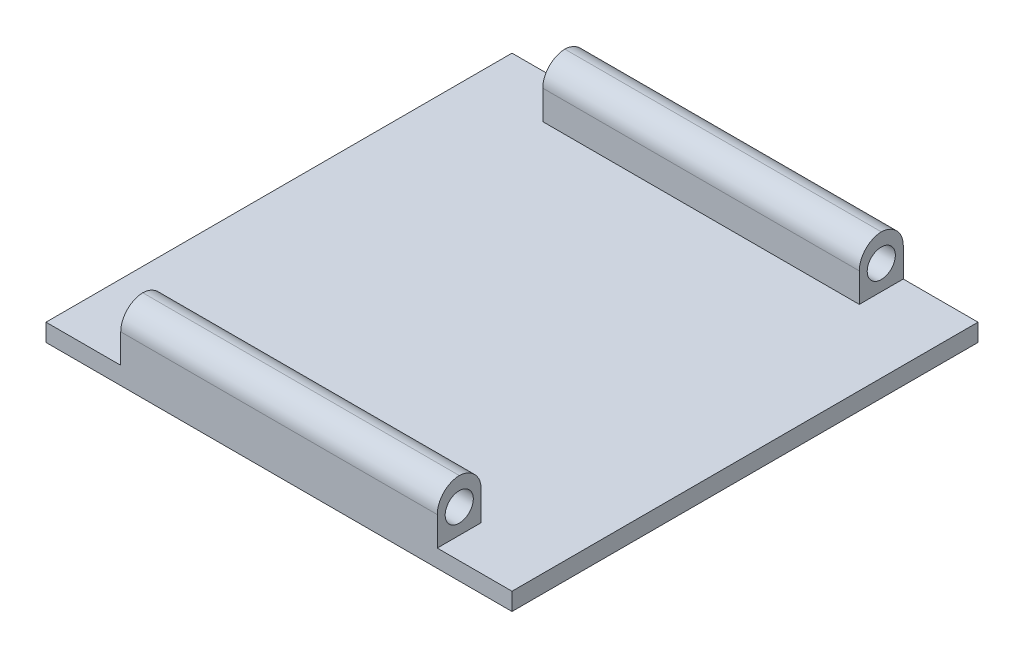
ISO-10303-21;
HEADER;
FILE_DESCRIPTION(('STEP AP214'),'2;1');
FILE_NAME('part.step','',(''),(''),'','','');
FILE_SCHEMA(('AUTOMOTIVE_DESIGN { 1 0 10303 214 1 1 1 1 }'));
ENDSEC;
DATA;
#1=APPLICATION_CONTEXT('core data for automotive mechanical design processes');
#2=APPLICATION_PROTOCOL_DEFINITION('international standard','automotive_design',2000,#1);
#3=PRODUCT_CONTEXT('',#1,'mechanical');
#4=PRODUCT('Part','Part','',(#3));
#5=PRODUCT_RELATED_PRODUCT_CATEGORY('part','',(#4));
#6=PRODUCT_DEFINITION_FORMATION('','',#4);
#7=PRODUCT_DEFINITION_CONTEXT('part definition',#1,'design');
#8=PRODUCT_DEFINITION('design','',#6,#7);
#9=PRODUCT_DEFINITION_SHAPE('','',#8);
#10=(LENGTH_UNIT() NAMED_UNIT(*) SI_UNIT(.MILLI.,.METRE.));
#11=(NAMED_UNIT(*) PLANE_ANGLE_UNIT() SI_UNIT($,.RADIAN.));
#12=(NAMED_UNIT(*) SI_UNIT($,.STERADIAN.) SOLID_ANGLE_UNIT());
#13=UNCERTAINTY_MEASURE_WITH_UNIT(LENGTH_MEASURE(1.E-05),#10,'distance_accuracy_value','');
#14=(GEOMETRIC_REPRESENTATION_CONTEXT(3) GLOBAL_UNCERTAINTY_ASSIGNED_CONTEXT((#13)) GLOBAL_UNIT_ASSIGNED_CONTEXT((#10,
#11,#12)) REPRESENTATION_CONTEXT('',''));
#15=CARTESIAN_POINT('',(0.,0.,0.));
#16=DIRECTION('',(0.,0.,1.));
#17=DIRECTION('',(1.,0.,0.));
#18=AXIS2_PLACEMENT_3D('',#15,#16,#17);
#19=CARTESIAN_POINT('',(0.,2.,0.));
#20=DIRECTION('',(0.,-1.,0.));
#21=DIRECTION('',(0.,0.,-1.));
#22=AXIS2_PLACEMENT_3D('',#19,#20,#21);
#23=PLANE('',#22);
#24=DIRECTION('',(0.,0.,1.));
#25=VECTOR('',#24,1.);
#26=CARTESIAN_POINT('',(-18.,2.,26.5));
#27=LINE('',#26,#25);
#28=CARTESIAN_POINT('',(-18.,2.,21.5));
#29=VERTEX_POINT('',#28);
#30=CARTESIAN_POINT('',(-18.,2.,26.5));
#31=VERTEX_POINT('',#30);
#32=EDGE_CURVE('E165',#29,#31,#27,.T.);
#33=ORIENTED_EDGE('',*,*,#32,.F.);
#34=DIRECTION('',(-1.,0.,0.));
#35=VECTOR('',#34,1.);
#36=CARTESIAN_POINT('',(-18.,2.,21.5));
#37=LINE('',#36,#35);
#38=CARTESIAN_POINT('',(18.,2.,21.5));
#39=VERTEX_POINT('',#38);
#40=EDGE_CURVE('E163',#39,#29,#37,.T.);
#41=ORIENTED_EDGE('',*,*,#40,.F.);
#42=DIRECTION('',(0.,0.,-1.));
#43=VECTOR('',#42,1.);
#44=CARTESIAN_POINT('',(18.,2.,21.5));
#45=LINE('',#44,#43);
#46=CARTESIAN_POINT('',(18.,2.,26.5));
#47=VERTEX_POINT('',#46);
#48=EDGE_CURVE('E141',#47,#39,#45,.T.);
#49=ORIENTED_EDGE('',*,*,#48,.F.);
#50=DIRECTION('',(1.,0.,0.));
#51=VECTOR('',#50,1.);
#52=CARTESIAN_POINT('',(-26.5,2.,26.5));
#53=LINE('',#52,#51);
#54=CARTESIAN_POINT('',(26.5,2.,26.5));
#55=VERTEX_POINT('',#54);
#56=EDGE_CURVE('E149',#47,#55,#53,.T.);
#57=ORIENTED_EDGE('',*,*,#56,.T.);
#58=DIRECTION('',(0.,0.,-1.));
#59=VECTOR('',#58,1.);
#60=CARTESIAN_POINT('',(26.5,2.,26.5));
#61=LINE('',#60,#59);
#62=CARTESIAN_POINT('',(26.5,2.,-26.5));
#63=VERTEX_POINT('',#62);
#64=EDGE_CURVE('E207',#55,#63,#61,.T.);
#65=ORIENTED_EDGE('',*,*,#64,.T.);
#66=DIRECTION('',(-1.,0.,0.));
#67=VECTOR('',#66,1.);
#68=CARTESIAN_POINT('',(-26.5,2.,-26.5));
#69=LINE('',#68,#67);
#70=CARTESIAN_POINT('',(18.,2.,-26.5));
#71=VERTEX_POINT('',#70);
#72=EDGE_CURVE('E212',#63,#71,#69,.T.);
#73=ORIENTED_EDGE('',*,*,#72,.T.);
#74=DIRECTION('',(0.,0.,-1.));
#75=VECTOR('',#74,1.);
#76=CARTESIAN_POINT('',(18.,2.,-21.5));
#77=LINE('',#76,#75);
#78=CARTESIAN_POINT('',(18.,2.,-21.5));
#79=VERTEX_POINT('',#78);
#80=EDGE_CURVE('E190',#79,#71,#77,.T.);
#81=ORIENTED_EDGE('',*,*,#80,.F.);
#82=DIRECTION('',(1.,0.,0.));
#83=VECTOR('',#82,1.);
#84=CARTESIAN_POINT('',(-18.,2.,-21.5));
#85=LINE('',#84,#83);
#86=CARTESIAN_POINT('',(-18.,2.,-21.5));
#87=VERTEX_POINT('',#86);
#88=EDGE_CURVE('E186',#87,#79,#85,.T.);
#89=ORIENTED_EDGE('',*,*,#88,.F.);
#90=DIRECTION('',(0.,0.,1.));
#91=VECTOR('',#90,1.);
#92=CARTESIAN_POINT('',(-18.,2.,-26.5));
#93=LINE('',#92,#91);
#94=CARTESIAN_POINT('',(-18.,2.,-26.5));
#95=VERTEX_POINT('',#94);
#96=EDGE_CURVE('E182',#95,#87,#93,.T.);
#97=ORIENTED_EDGE('',*,*,#96,.F.);
#98=CARTESIAN_POINT('',(-26.5,2.,-26.5));
#99=VERTEX_POINT('',#98);
#100=EDGE_CURVE('E210',#95,#99,#69,.T.);
#101=ORIENTED_EDGE('',*,*,#100,.T.);
#102=DIRECTION('',(0.,0.,1.));
#103=VECTOR('',#102,1.);
#104=CARTESIAN_POINT('',(-26.5,2.,26.5));
#105=LINE('',#104,#103);
#106=CARTESIAN_POINT('',(-26.5,2.,26.5));
#107=VERTEX_POINT('',#106);
#108=EDGE_CURVE('E158',#99,#107,#105,.T.);
#109=ORIENTED_EDGE('',*,*,#108,.T.);
#110=EDGE_CURVE('E157',#107,#31,#53,.T.);
#111=ORIENTED_EDGE('',*,*,#110,.T.);
#112=EDGE_LOOP('',(#33,#41,#49,#57,#65,#73,#81,#89,#97,#101,#109,#111));
#113=FACE_BOUND('',#112,.T.);
#114=ADVANCED_FACE('F39',(#113),#23,.F.);
#115=CARTESIAN_POINT('',(26.5,2.,26.5));
#116=DIRECTION('',(-1.,0.,0.));
#117=DIRECTION('',(0.,0.,1.));
#118=AXIS2_PLACEMENT_3D('',#115,#116,#117);
#119=PLANE('',#118);
#120=DIRECTION('',(0.,0.,-1.));
#121=VECTOR('',#120,1.);
#122=CARTESIAN_POINT('',(26.5,0.,26.5));
#123=LINE('',#122,#121);
#124=CARTESIAN_POINT('',(26.5,0.,26.5));
#125=VERTEX_POINT('',#124);
#126=CARTESIAN_POINT('',(26.5,0.,-26.5));
#127=VERTEX_POINT('',#126);
#128=EDGE_CURVE('E206',#125,#127,#123,.T.);
#129=ORIENTED_EDGE('',*,*,#128,.T.);
#130=DIRECTION('',(0.,-1.,0.));
#131=VECTOR('',#130,1.);
#132=CARTESIAN_POINT('',(26.5,2.,-26.5));
#133=LINE('',#132,#131);
#134=EDGE_CURVE('E241',#63,#127,#133,.T.);
#135=ORIENTED_EDGE('',*,*,#134,.F.);
#136=ORIENTED_EDGE('',*,*,#64,.F.);
#137=DIRECTION('',(0.,-1.,0.));
#138=VECTOR('',#137,1.);
#139=CARTESIAN_POINT('',(26.5,2.,26.5));
#140=LINE('',#139,#138);
#141=EDGE_CURVE('E152',#55,#125,#140,.T.);
#142=ORIENTED_EDGE('',*,*,#141,.T.);
#143=EDGE_LOOP('',(#129,#135,#136,#142));
#144=FACE_BOUND('',#143,.T.);
#145=ADVANCED_FACE('F318',(#144),#119,.F.);
#146=CARTESIAN_POINT('',(-26.5,2.,-26.5));
#147=DIRECTION('',(0.,0.,1.));
#148=DIRECTION('',(1.,0.,0.));
#149=AXIS2_PLACEMENT_3D('',#146,#147,#148);
#150=PLANE('',#149);
#151=DIRECTION('',(0.,-1.,0.));
#152=VECTOR('',#151,1.);
#153=CARTESIAN_POINT('',(-18.,7.9,-26.5));
#154=LINE('',#153,#152);
#155=CARTESIAN_POINT('',(-18.,5.3,-26.5));
#156=VERTEX_POINT('',#155);
#157=EDGE_CURVE('E194',#156,#95,#154,.T.);
#158=ORIENTED_EDGE('',*,*,#157,.F.);
#159=DIRECTION('',(-1.,0.,0.));
#160=VECTOR('',#159,1.);
#161=CARTESIAN_POINT('',(18.,5.3,-26.5));
#162=LINE('',#161,#160);
#163=CARTESIAN_POINT('',(18.,5.3,-26.5));
#164=VERTEX_POINT('',#163);
#165=EDGE_CURVE('E251',#156,#164,#162,.F.);
#166=ORIENTED_EDGE('',*,*,#165,.T.);
#167=DIRECTION('',(0.,-1.,0.));
#168=VECTOR('',#167,1.);
#169=CARTESIAN_POINT('',(18.,7.9,-26.5));
#170=LINE('',#169,#168);
#171=EDGE_CURVE('E197',#164,#71,#170,.T.);
#172=ORIENTED_EDGE('',*,*,#171,.T.);
#173=ORIENTED_EDGE('',*,*,#72,.F.);
#174=ORIENTED_EDGE('',*,*,#134,.T.);
#175=DIRECTION('',(-1.,0.,0.));
#176=VECTOR('',#175,1.);
#177=CARTESIAN_POINT('',(-26.5,0.,-26.5));
#178=LINE('',#177,#176);
#179=CARTESIAN_POINT('',(-26.5,0.,-26.5));
#180=VERTEX_POINT('',#179);
#181=EDGE_CURVE('E223',#127,#180,#178,.T.);
#182=ORIENTED_EDGE('',*,*,#181,.T.);
#183=DIRECTION('',(0.,-1.,0.));
#184=VECTOR('',#183,1.);
#185=CARTESIAN_POINT('',(-26.5,2.,-26.5));
#186=LINE('',#185,#184);
#187=EDGE_CURVE('E237',#99,#180,#186,.T.);
#188=ORIENTED_EDGE('',*,*,#187,.F.);
#189=ORIENTED_EDGE('',*,*,#100,.F.);
#190=EDGE_LOOP('',(#158,#166,#172,#173,#174,#182,#188,#189));
#191=FACE_BOUND('',#190,.T.);
#192=ADVANCED_FACE('F323',(#191),#150,.F.);
#193=CARTESIAN_POINT('',(-26.5,2.,26.5));
#194=DIRECTION('',(1.,0.,0.));
#195=DIRECTION('',(0.,0.,-1.));
#196=AXIS2_PLACEMENT_3D('',#193,#194,#195);
#197=PLANE('',#196);
#198=DIRECTION('',(0.,0.,1.));
#199=VECTOR('',#198,1.);
#200=CARTESIAN_POINT('',(-26.5,0.,26.5));
#201=LINE('',#200,#199);
#202=CARTESIAN_POINT('',(-26.5,0.,26.5));
#203=VERTEX_POINT('',#202);
#204=EDGE_CURVE('E226',#180,#203,#201,.T.);
#205=ORIENTED_EDGE('',*,*,#204,.T.);
#206=DIRECTION('',(0.,-1.,0.));
#207=VECTOR('',#206,1.);
#208=CARTESIAN_POINT('',(-26.5,2.,26.5));
#209=LINE('',#208,#207);
#210=EDGE_CURVE('E233',#107,#203,#209,.T.);
#211=ORIENTED_EDGE('',*,*,#210,.F.);
#212=ORIENTED_EDGE('',*,*,#108,.F.);
#213=ORIENTED_EDGE('',*,*,#187,.T.);
#214=EDGE_LOOP('',(#205,#211,#212,#213));
#215=FACE_BOUND('',#214,.T.);
#216=ADVANCED_FACE('F336',(#215),#197,.F.);
#217=CARTESIAN_POINT('',(-26.5,2.,26.5));
#218=DIRECTION('',(0.,0.,-1.));
#219=DIRECTION('',(-1.,0.,0.));
#220=AXIS2_PLACEMENT_3D('',#217,#218,#219);
#221=PLANE('',#220);
#222=DIRECTION('',(0.,-1.,0.));
#223=VECTOR('',#222,1.);
#224=CARTESIAN_POINT('',(18.,7.9,26.5));
#225=LINE('',#224,#223);
#226=CARTESIAN_POINT('',(18.,5.3,26.5));
#227=VERTEX_POINT('',#226);
#228=EDGE_CURVE('E137',#227,#47,#225,.T.);
#229=ORIENTED_EDGE('',*,*,#228,.F.);
#230=DIRECTION('',(1.,0.,0.));
#231=VECTOR('',#230,1.);
#232=CARTESIAN_POINT('',(-26.5,5.3,26.5));
#233=LINE('',#232,#231);
#234=CARTESIAN_POINT('',(-18.,5.3,26.5));
#235=VERTEX_POINT('',#234);
#236=EDGE_CURVE('E11',#227,#235,#233,.F.);
#237=ORIENTED_EDGE('',*,*,#236,.T.);
#238=DIRECTION('',(0.,-1.,0.));
#239=VECTOR('',#238,1.);
#240=CARTESIAN_POINT('',(-18.,7.9,26.5));
#241=LINE('',#240,#239);
#242=EDGE_CURVE('E145',#235,#31,#241,.T.);
#243=ORIENTED_EDGE('',*,*,#242,.T.);
#244=ORIENTED_EDGE('',*,*,#110,.F.);
#245=ORIENTED_EDGE('',*,*,#210,.T.);
#246=DIRECTION('',(1.,0.,0.));
#247=VECTOR('',#246,1.);
#248=CARTESIAN_POINT('',(-26.5,0.,26.5));
#249=LINE('',#248,#247);
#250=EDGE_CURVE('E211',#203,#125,#249,.T.);
#251=ORIENTED_EDGE('',*,*,#250,.T.);
#252=ORIENTED_EDGE('',*,*,#141,.F.);
#253=ORIENTED_EDGE('',*,*,#56,.F.);
#254=EDGE_LOOP('',(#229,#237,#243,#244,#245,#251,#252,#253));
#255=FACE_BOUND('',#254,.T.);
#256=ADVANCED_FACE('F150',(#255),#221,.F.);
#257=CARTESIAN_POINT('',(0.,0.,0.));
#258=DIRECTION('',(0.,-1.,0.));
#259=DIRECTION('',(0.,0.,-1.));
#260=AXIS2_PLACEMENT_3D('',#257,#258,#259);
#261=PLANE('',#260);
#262=ORIENTED_EDGE('',*,*,#128,.F.);
#263=ORIENTED_EDGE('',*,*,#250,.F.);
#264=ORIENTED_EDGE('',*,*,#204,.F.);
#265=ORIENTED_EDGE('',*,*,#181,.F.);
#266=EDGE_LOOP('',(#262,#263,#264,#265));
#267=FACE_BOUND('',#266,.T.);
#268=ADVANCED_FACE('F330',(#267),#261,.T.);
#269=CARTESIAN_POINT('',(-18.,7.9,-26.5));
#270=DIRECTION('',(1.,0.,0.));
#271=DIRECTION('',(0.,0.,-1.));
#272=AXIS2_PLACEMENT_3D('',#269,#270,#271);
#273=PLANE('',#272);
#274=CARTESIAN_POINT('',(-18.,4.8,-24.));
#275=DIRECTION('',(1.,0.,0.));
#276=DIRECTION('',(0.,0.,1.));
#277=AXIS2_PLACEMENT_3D('',#274,#275,#276);
#278=CIRCLE('',#277,1.60000000000001);
#279=CARTESIAN_POINT('',(-18.,4.8,-22.4));
#280=VERTEX_POINT('',#279);
#281=EDGE_CURVE('E280',#280,#280,#278,.T.);
#282=ORIENTED_EDGE('',*,*,#281,.T.);
#283=EDGE_LOOP('',(#282));
#284=FACE_BOUND('',#283,.T.);
#285=CARTESIAN_POINT('',(-18.,5.3,-24.1));
#286=DIRECTION('',(1.,0.,0.));
#287=DIRECTION('',(0.,0.,-1.));
#288=AXIS2_PLACEMENT_3D('',#285,#286,#287);
#289=CIRCLE('',#288,2.6);
#290=CARTESIAN_POINT('',(-18.,5.3,-21.5));
#291=VERTEX_POINT('',#290);
#292=CARTESIAN_POINT('',(-18.,7.89807621135332,-24.));
#293=VERTEX_POINT('',#292);
#294=EDGE_CURVE('E245',#291,#293,#289,.F.);
#295=ORIENTED_EDGE('',*,*,#294,.T.);
#296=CARTESIAN_POINT('',(-18.,5.3,-23.9));
#297=DIRECTION('',(1.,0.,0.));
#298=DIRECTION('',(0.,0.,-1.));
#299=AXIS2_PLACEMENT_3D('',#296,#297,#298);
#300=CIRCLE('',#299,2.6);
#301=EDGE_CURVE('E248',#293,#156,#300,.F.);
#302=ORIENTED_EDGE('',*,*,#301,.T.);
#303=ORIENTED_EDGE('',*,*,#157,.T.);
#304=ORIENTED_EDGE('',*,*,#96,.T.);
#305=DIRECTION('',(0.,-1.,0.));
#306=VECTOR('',#305,1.);
#307=CARTESIAN_POINT('',(-18.,7.9,-21.5));
#308=LINE('',#307,#306);
#309=EDGE_CURVE('E203',#291,#87,#308,.T.);
#310=ORIENTED_EDGE('',*,*,#309,.F.);
#311=EDGE_LOOP('',(#295,#302,#303,#304,#310));
#312=FACE_BOUND('',#311,.T.);
#313=ADVANCED_FACE('F328',(#284,#312),#273,.F.);
#314=CARTESIAN_POINT('',(-18.,7.9,-21.5));
#315=DIRECTION('',(0.,0.,-1.));
#316=DIRECTION('',(-1.,0.,0.));
#317=AXIS2_PLACEMENT_3D('',#314,#315,#316);
#318=PLANE('',#317);
#319=DIRECTION('',(0.,-1.,0.));
#320=VECTOR('',#319,1.);
#321=CARTESIAN_POINT('',(18.,7.9,-21.5));
#322=LINE('',#321,#320);
#323=CARTESIAN_POINT('',(18.,5.3,-21.5));
#324=VERTEX_POINT('',#323);
#325=EDGE_CURVE('E200',#324,#79,#322,.T.);
#326=ORIENTED_EDGE('',*,*,#325,.F.);
#327=DIRECTION('',(1.,0.,0.));
#328=VECTOR('',#327,1.);
#329=CARTESIAN_POINT('',(-18.,5.3,-21.5));
#330=LINE('',#329,#328);
#331=EDGE_CURVE('E261',#324,#291,#330,.F.);
#332=ORIENTED_EDGE('',*,*,#331,.T.);
#333=ORIENTED_EDGE('',*,*,#309,.T.);
#334=ORIENTED_EDGE('',*,*,#88,.T.);
#335=EDGE_LOOP('',(#326,#332,#333,#334));
#336=FACE_BOUND('',#335,.T.);
#337=ADVANCED_FACE('F467',(#336),#318,.F.);
#338=CARTESIAN_POINT('',(18.,7.9,-21.5));
#339=DIRECTION('',(-1.,0.,0.));
#340=DIRECTION('',(0.,0.,1.));
#341=AXIS2_PLACEMENT_3D('',#338,#339,#340);
#342=PLANE('',#341);
#343=CARTESIAN_POINT('',(18.,4.8,-24.));
#344=DIRECTION('',(1.,0.,0.));
#345=DIRECTION('',(0.,0.,1.));
#346=AXIS2_PLACEMENT_3D('',#343,#344,#345);
#347=CIRCLE('',#346,1.6);
#348=CARTESIAN_POINT('',(18.,4.8,-22.4));
#349=VERTEX_POINT('',#348);
#350=EDGE_CURVE('E517',#349,#349,#347,.T.);
#351=ORIENTED_EDGE('',*,*,#350,.F.);
#352=EDGE_LOOP('',(#351));
#353=FACE_BOUND('',#352,.T.);
#354=ORIENTED_EDGE('',*,*,#171,.F.);
#355=CARTESIAN_POINT('',(18.,5.3,-23.9));
#356=DIRECTION('',(-1.,0.,0.));
#357=DIRECTION('',(0.,0.,1.));
#358=AXIS2_PLACEMENT_3D('',#355,#356,#357);
#359=CIRCLE('',#358,2.6);
#360=CARTESIAN_POINT('',(18.,7.89807621135332,-24.));
#361=VERTEX_POINT('',#360);
#362=EDGE_CURVE('E258',#164,#361,#359,.F.);
#363=ORIENTED_EDGE('',*,*,#362,.T.);
#364=CARTESIAN_POINT('',(18.,5.3,-24.1));
#365=DIRECTION('',(-1.,0.,0.));
#366=DIRECTION('',(0.,0.,1.));
#367=AXIS2_PLACEMENT_3D('',#364,#365,#366);
#368=CIRCLE('',#367,2.6);
#369=EDGE_CURVE('E255',#361,#324,#368,.F.);
#370=ORIENTED_EDGE('',*,*,#369,.T.);
#371=ORIENTED_EDGE('',*,*,#325,.T.);
#372=ORIENTED_EDGE('',*,*,#80,.T.);
#373=EDGE_LOOP('',(#354,#363,#370,#371,#372));
#374=FACE_BOUND('',#373,.T.);
#375=ADVANCED_FACE('F476',(#353,#374),#342,.F.);
#376=CARTESIAN_POINT('',(-18.,7.9,26.5));
#377=DIRECTION('',(1.,0.,0.));
#378=DIRECTION('',(0.,0.,-1.));
#379=AXIS2_PLACEMENT_3D('',#376,#377,#378);
#380=PLANE('',#379);
#381=CARTESIAN_POINT('',(-18.,4.8,24.));
#382=DIRECTION('',(1.,0.,0.));
#383=DIRECTION('',(0.,0.,-1.));
#384=AXIS2_PLACEMENT_3D('',#381,#382,#383);
#385=CIRCLE('',#384,1.60000000000001);
#386=CARTESIAN_POINT('',(-18.,4.8,22.4));
#387=VERTEX_POINT('',#386);
#388=EDGE_CURVE('E509',#387,#387,#385,.T.);
#389=ORIENTED_EDGE('',*,*,#388,.T.);
#390=EDGE_LOOP('',(#389));
#391=FACE_BOUND('',#390,.T.);
#392=CARTESIAN_POINT('',(-18.,5.3,23.9));
#393=DIRECTION('',(1.,0.,0.));
#394=DIRECTION('',(0.,0.,-1.));
#395=AXIS2_PLACEMENT_3D('',#392,#393,#394);
#396=CIRCLE('',#395,2.6);
#397=CARTESIAN_POINT('',(-18.,7.89807621135332,24.));
#398=VERTEX_POINT('',#397);
#399=EDGE_CURVE('E264',#235,#398,#396,.F.);
#400=ORIENTED_EDGE('',*,*,#399,.T.);
#401=CARTESIAN_POINT('',(-18.,5.3,24.1));
#402=DIRECTION('',(1.,0.,0.));
#403=DIRECTION('',(0.,0.,-1.));
#404=AXIS2_PLACEMENT_3D('',#401,#402,#403);
#405=CIRCLE('',#404,2.6);
#406=CARTESIAN_POINT('',(-18.,5.3,21.5));
#407=VERTEX_POINT('',#406);
#408=EDGE_CURVE('E267',#398,#407,#405,.F.);
#409=ORIENTED_EDGE('',*,*,#408,.T.);
#410=DIRECTION('',(0.,-1.,0.));
#411=VECTOR('',#410,1.);
#412=CARTESIAN_POINT('',(-18.,7.9,21.5));
#413=LINE('',#412,#411);
#414=EDGE_CURVE('E169',#407,#29,#413,.T.);
#415=ORIENTED_EDGE('',*,*,#414,.T.);
#416=ORIENTED_EDGE('',*,*,#32,.T.);
#417=ORIENTED_EDGE('',*,*,#242,.F.);
#418=EDGE_LOOP('',(#400,#409,#415,#416,#417));
#419=FACE_BOUND('',#418,.T.);
#420=ADVANCED_FACE('F300',(#391,#419),#380,.F.);
#421=CARTESIAN_POINT('',(18.,7.9,21.5));
#422=DIRECTION('',(-1.,0.,0.));
#423=DIRECTION('',(0.,0.,1.));
#424=AXIS2_PLACEMENT_3D('',#421,#422,#423);
#425=PLANE('',#424);
#426=CARTESIAN_POINT('',(18.,4.8,24.));
#427=DIRECTION('',(1.,0.,0.));
#428=DIRECTION('',(0.,0.,-1.));
#429=AXIS2_PLACEMENT_3D('',#426,#427,#428);
#430=CIRCLE('',#429,1.6);
#431=CARTESIAN_POINT('',(18.,4.8,22.4));
#432=VERTEX_POINT('',#431);
#433=EDGE_CURVE('E525',#432,#432,#430,.T.);
#434=ORIENTED_EDGE('',*,*,#433,.F.);
#435=EDGE_LOOP('',(#434));
#436=FACE_BOUND('',#435,.T.);
#437=DIRECTION('',(0.,-1.,0.));
#438=VECTOR('',#437,1.);
#439=CARTESIAN_POINT('',(18.,7.9,21.5));
#440=LINE('',#439,#438);
#441=CARTESIAN_POINT('',(18.,5.3,21.5));
#442=VERTEX_POINT('',#441);
#443=EDGE_CURVE('E146',#442,#39,#440,.T.);
#444=ORIENTED_EDGE('',*,*,#443,.F.);
#445=CARTESIAN_POINT('',(18.,5.3,24.1));
#446=DIRECTION('',(-1.,0.,0.));
#447=DIRECTION('',(0.,0.,1.));
#448=AXIS2_PLACEMENT_3D('',#445,#446,#447);
#449=CIRCLE('',#448,2.6);
#450=CARTESIAN_POINT('',(18.,7.89807621135332,24.));
#451=VERTEX_POINT('',#450);
#452=EDGE_CURVE('E49',#442,#451,#449,.F.);
#453=ORIENTED_EDGE('',*,*,#452,.T.);
#454=CARTESIAN_POINT('',(18.,5.3,23.9));
#455=DIRECTION('',(-1.,0.,0.));
#456=DIRECTION('',(0.,0.,1.));
#457=AXIS2_PLACEMENT_3D('',#454,#455,#456);
#458=CIRCLE('',#457,2.6);
#459=EDGE_CURVE('E60',#451,#227,#458,.F.);
#460=ORIENTED_EDGE('',*,*,#459,.T.);
#461=ORIENTED_EDGE('',*,*,#228,.T.);
#462=ORIENTED_EDGE('',*,*,#48,.T.);
#463=EDGE_LOOP('',(#444,#453,#460,#461,#462));
#464=FACE_BOUND('',#463,.T.);
#465=ADVANCED_FACE('F139',(#436,#464),#425,.F.);
#466=CARTESIAN_POINT('',(-18.,7.9,21.5));
#467=DIRECTION('',(0.,0.,1.));
#468=DIRECTION('',(1.,0.,0.));
#469=AXIS2_PLACEMENT_3D('',#466,#467,#468);
#470=PLANE('',#469);
#471=ORIENTED_EDGE('',*,*,#414,.F.);
#472=DIRECTION('',(-1.,0.,0.));
#473=VECTOR('',#472,1.);
#474=CARTESIAN_POINT('',(-18.,5.3,21.5));
#475=LINE('',#474,#473);
#476=EDGE_CURVE('E270',#407,#442,#475,.F.);
#477=ORIENTED_EDGE('',*,*,#476,.T.);
#478=ORIENTED_EDGE('',*,*,#443,.T.);
#479=ORIENTED_EDGE('',*,*,#40,.T.);
#480=EDGE_LOOP('',(#471,#477,#478,#479));
#481=FACE_BOUND('',#480,.T.);
#482=ADVANCED_FACE('F303',(#481),#470,.F.);
#483=CARTESIAN_POINT('',(14.4,4.8,24.));
#484=DIRECTION('',(1.,0.,0.));
#485=DIRECTION('',(0.,0.,-1.));
#486=AXIS2_PLACEMENT_3D('',#483,#484,#485);
#487=CYLINDRICAL_SURFACE('',#486,1.6);
#488=CARTESIAN_POINT('',(14.4,4.8,24.));
#489=DIRECTION('',(1.,0.,0.));
#490=DIRECTION('',(0.,0.,-1.));
#491=AXIS2_PLACEMENT_3D('',#488,#489,#490);
#492=CIRCLE('',#491,1.6);
#493=CARTESIAN_POINT('',(14.4,4.8,22.4));
#494=VERTEX_POINT('',#493);
#495=EDGE_CURVE('E172',#494,#494,#492,.T.);
#496=ORIENTED_EDGE('',*,*,#495,.F.);
#497=EDGE_LOOP('',(#496));
#498=FACE_BOUND('',#497,.T.);
#499=ORIENTED_EDGE('',*,*,#433,.T.);
#500=EDGE_LOOP('',(#499));
#501=FACE_BOUND('',#500,.T.);
#502=ADVANCED_FACE('F305',(#498,#501),#487,.F.);
#503=CARTESIAN_POINT('',(14.4,4.8,24.));
#504=DIRECTION('',(1.,0.,0.));
#505=DIRECTION('',(0.,0.,-1.));
#506=AXIS2_PLACEMENT_3D('',#503,#504,#505);
#507=PLANE('',#506);
#508=ORIENTED_EDGE('',*,*,#495,.T.);
#509=EDGE_LOOP('',(#508));
#510=FACE_BOUND('',#509,.T.);
#511=ADVANCED_FACE('F311',(#510),#507,.T.);
#512=CARTESIAN_POINT('',(14.4,4.8,-24.));
#513=DIRECTION('',(1.,0.,0.));
#514=DIRECTION('',(0.,0.,-1.));
#515=AXIS2_PLACEMENT_3D('',#512,#513,#514);
#516=CYLINDRICAL_SURFACE('',#515,1.6);
#517=CARTESIAN_POINT('',(14.4,4.8,-24.));
#518=DIRECTION('',(1.,0.,0.));
#519=DIRECTION('',(0.,0.,1.));
#520=AXIS2_PLACEMENT_3D('',#517,#518,#519);
#521=CIRCLE('',#520,1.6);
#522=CARTESIAN_POINT('',(14.4,4.8,-22.4));
#523=VERTEX_POINT('',#522);
#524=EDGE_CURVE('E529',#523,#523,#521,.T.);
#525=ORIENTED_EDGE('',*,*,#524,.F.);
#526=EDGE_LOOP('',(#525));
#527=FACE_BOUND('',#526,.T.);
#528=ORIENTED_EDGE('',*,*,#350,.T.);
#529=EDGE_LOOP('',(#528));
#530=FACE_BOUND('',#529,.T.);
#531=ADVANCED_FACE('F403',(#527,#530),#516,.F.);
#532=CARTESIAN_POINT('',(14.4,4.8,-24.));
#533=DIRECTION('',(-1.,0.,0.));
#534=DIRECTION('',(0.,0.,1.));
#535=AXIS2_PLACEMENT_3D('',#532,#533,#534);
#536=PLANE('',#535);
#537=ORIENTED_EDGE('',*,*,#524,.T.);
#538=EDGE_LOOP('',(#537));
#539=FACE_BOUND('',#538,.T.);
#540=ADVANCED_FACE('F395',(#539),#536,.F.);
#541=CARTESIAN_POINT('',(-14.4,4.8,24.));
#542=DIRECTION('',(-1.,0.,0.));
#543=DIRECTION('',(0.,0.,1.));
#544=AXIS2_PLACEMENT_3D('',#541,#542,#543);
#545=CYLINDRICAL_SURFACE('',#544,1.60000000000001);
#546=CARTESIAN_POINT('',(-14.4,4.8,24.));
#547=DIRECTION('',(1.,0.,0.));
#548=DIRECTION('',(0.,0.,-1.));
#549=AXIS2_PLACEMENT_3D('',#546,#547,#548);
#550=CIRCLE('',#549,1.60000000000001);
#551=CARTESIAN_POINT('',(-14.4,4.8,22.4));
#552=VERTEX_POINT('',#551);
#553=EDGE_CURVE('E512',#552,#552,#550,.T.);
#554=ORIENTED_EDGE('',*,*,#553,.T.);
#555=EDGE_LOOP('',(#554));
#556=FACE_BOUND('',#555,.T.);
#557=ORIENTED_EDGE('',*,*,#388,.F.);
#558=EDGE_LOOP('',(#557));
#559=FACE_BOUND('',#558,.T.);
#560=ADVANCED_FACE('F387',(#556,#559),#545,.F.);
#561=CARTESIAN_POINT('',(-14.4,4.8,24.));
#562=DIRECTION('',(1.,0.,0.));
#563=DIRECTION('',(0.,0.,-1.));
#564=AXIS2_PLACEMENT_3D('',#561,#562,#563);
#565=PLANE('',#564);
#566=ORIENTED_EDGE('',*,*,#553,.F.);
#567=EDGE_LOOP('',(#566));
#568=FACE_BOUND('',#567,.T.);
#569=ADVANCED_FACE('F379',(#568),#565,.F.);
#570=CARTESIAN_POINT('',(-14.4,4.8,-24.));
#571=DIRECTION('',(-1.,0.,0.));
#572=DIRECTION('',(0.,0.,1.));
#573=AXIS2_PLACEMENT_3D('',#570,#571,#572);
#574=CYLINDRICAL_SURFACE('',#573,1.60000000000001);
#575=CARTESIAN_POINT('',(-14.4,4.8,-24.));
#576=DIRECTION('',(1.,0.,0.));
#577=DIRECTION('',(0.,0.,1.));
#578=AXIS2_PLACEMENT_3D('',#575,#576,#577);
#579=CIRCLE('',#578,1.60000000000001);
#580=CARTESIAN_POINT('',(-14.4,4.8,-22.4));
#581=VERTEX_POINT('',#580);
#582=EDGE_CURVE('E287',#581,#581,#579,.T.);
#583=ORIENTED_EDGE('',*,*,#582,.T.);
#584=EDGE_LOOP('',(#583));
#585=FACE_BOUND('',#584,.T.);
#586=ORIENTED_EDGE('',*,*,#281,.F.);
#587=EDGE_LOOP('',(#586));
#588=FACE_BOUND('',#587,.T.);
#589=ADVANCED_FACE('F370',(#585,#588),#574,.F.);
#590=CARTESIAN_POINT('',(-14.4,4.8,-24.));
#591=DIRECTION('',(-1.,0.,0.));
#592=DIRECTION('',(0.,0.,1.));
#593=AXIS2_PLACEMENT_3D('',#590,#591,#592);
#594=PLANE('',#593);
#595=ORIENTED_EDGE('',*,*,#582,.F.);
#596=EDGE_LOOP('',(#595));
#597=FACE_BOUND('',#596,.T.);
#598=ADVANCED_FACE('F348',(#597),#594,.T.);
#599=CARTESIAN_POINT('',(0.,5.3,-24.1));
#600=DIRECTION('',(-1.,0.,0.));
#601=DIRECTION('',(0.,0.,1.));
#602=AXIS2_PLACEMENT_3D('',#599,#600,#601);
#603=CYLINDRICAL_SURFACE('',#602,2.6);
#604=ORIENTED_EDGE('',*,*,#331,.F.);
#605=ORIENTED_EDGE('',*,*,#369,.F.);
#606=DIRECTION('',(-1.,0.,0.));
#607=VECTOR('',#606,1.);
#608=CARTESIAN_POINT('',(0.,7.89807621135332,-24.));
#609=LINE('',#608,#607);
#610=EDGE_CURVE('E277',#293,#361,#609,.F.);
#611=ORIENTED_EDGE('',*,*,#610,.F.);
#612=ORIENTED_EDGE('',*,*,#294,.F.);
#613=EDGE_LOOP('',(#604,#605,#611,#612));
#614=FACE_BOUND('',#613,.T.);
#615=ADVANCED_FACE('F346',(#614),#603,.T.);
#616=CARTESIAN_POINT('',(0.,5.3,-23.9));
#617=DIRECTION('',(1.,0.,0.));
#618=DIRECTION('',(0.,0.,-1.));
#619=AXIS2_PLACEMENT_3D('',#616,#617,#618);
#620=CYLINDRICAL_SURFACE('',#619,2.6);
#621=ORIENTED_EDGE('',*,*,#362,.F.);
#622=ORIENTED_EDGE('',*,*,#165,.F.);
#623=ORIENTED_EDGE('',*,*,#301,.F.);
#624=ORIENTED_EDGE('',*,*,#610,.T.);
#625=EDGE_LOOP('',(#621,#622,#623,#624));
#626=FACE_BOUND('',#625,.T.);
#627=ADVANCED_FACE('F343',(#626),#620,.T.);
#628=CARTESIAN_POINT('',(0.,5.3,23.9));
#629=DIRECTION('',(1.,0.,0.));
#630=DIRECTION('',(0.,0.,-1.));
#631=AXIS2_PLACEMENT_3D('',#628,#629,#630);
#632=CYLINDRICAL_SURFACE('',#631,2.6);
#633=ORIENTED_EDGE('',*,*,#236,.F.);
#634=ORIENTED_EDGE('',*,*,#459,.F.);
#635=DIRECTION('',(1.,0.,0.));
#636=VECTOR('',#635,1.);
#637=CARTESIAN_POINT('',(0.,7.89807621135332,24.));
#638=LINE('',#637,#636);
#639=EDGE_CURVE('E43',#398,#451,#638,.T.);
#640=ORIENTED_EDGE('',*,*,#639,.F.);
#641=ORIENTED_EDGE('',*,*,#399,.F.);
#642=EDGE_LOOP('',(#633,#634,#640,#641));
#643=FACE_BOUND('',#642,.T.);
#644=ADVANCED_FACE('F41',(#643),#632,.T.);
#645=CARTESIAN_POINT('',(0.,5.3,24.1));
#646=DIRECTION('',(-1.,0.,0.));
#647=DIRECTION('',(0.,0.,1.));
#648=AXIS2_PLACEMENT_3D('',#645,#646,#647);
#649=CYLINDRICAL_SURFACE('',#648,2.6);
#650=ORIENTED_EDGE('',*,*,#452,.F.);
#651=ORIENTED_EDGE('',*,*,#476,.F.);
#652=ORIENTED_EDGE('',*,*,#408,.F.);
#653=ORIENTED_EDGE('',*,*,#639,.T.);
#654=EDGE_LOOP('',(#650,#651,#652,#653));
#655=FACE_BOUND('',#654,.T.);
#656=ADVANCED_FACE('F293',(#655),#649,.T.);
#657=CLOSED_SHELL('',(#114,#145,#192,#216,#256,#268,#313,#337,#375,#420,#465,#482,#502,#511,
#531,#540,#560,#569,#589,#598,#615,#627,#644,#656));
#658=MANIFOLD_SOLID_BREP('B2',#657);
#659=ADVANCED_BREP_SHAPE_REPRESENTATION('',(#18,#658),#14);
#660=SHAPE_DEFINITION_REPRESENTATION(#9,#659);
ENDSEC;
END-ISO-10303-21;
